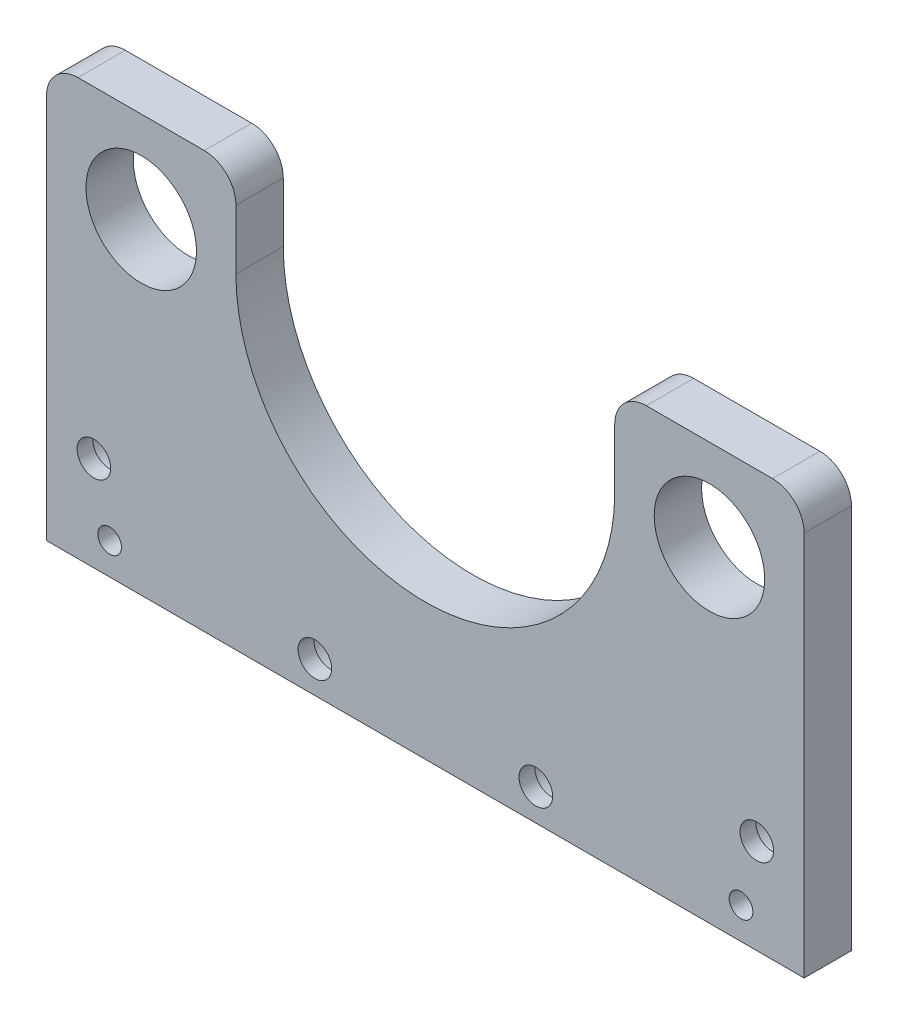
ISO-10303-21;
HEADER;
FILE_DESCRIPTION(('STEP AP214'),'2;1');
FILE_NAME('part.step','',(''),(''),'','','');
FILE_SCHEMA(('AUTOMOTIVE_DESIGN { 1 0 10303 214 1 1 1 1 }'));
ENDSEC;
DATA;
#1=APPLICATION_CONTEXT('core data for automotive mechanical design processes');
#2=APPLICATION_PROTOCOL_DEFINITION('international standard','automotive_design',2000,#1);
#3=PRODUCT_CONTEXT('',#1,'mechanical');
#4=PRODUCT('Part','Part','',(#3));
#5=PRODUCT_RELATED_PRODUCT_CATEGORY('part','',(#4));
#6=PRODUCT_DEFINITION_FORMATION('','',#4);
#7=PRODUCT_DEFINITION_CONTEXT('part definition',#1,'design');
#8=PRODUCT_DEFINITION('design','',#6,#7);
#9=PRODUCT_DEFINITION_SHAPE('','',#8);
#10=(LENGTH_UNIT() NAMED_UNIT(*) SI_UNIT(.MILLI.,.METRE.));
#11=(NAMED_UNIT(*) PLANE_ANGLE_UNIT() SI_UNIT($,.RADIAN.));
#12=(NAMED_UNIT(*) SI_UNIT($,.STERADIAN.) SOLID_ANGLE_UNIT());
#13=UNCERTAINTY_MEASURE_WITH_UNIT(LENGTH_MEASURE(1.E-05),#10,'distance_accuracy_value','');
#14=(GEOMETRIC_REPRESENTATION_CONTEXT(3) GLOBAL_UNCERTAINTY_ASSIGNED_CONTEXT((#13)) GLOBAL_UNIT_ASSIGNED_CONTEXT((#10,
#11,#12)) REPRESENTATION_CONTEXT('',''));
#15=CARTESIAN_POINT('',(0.,0.,0.));
#16=DIRECTION('',(0.,0.,1.));
#17=DIRECTION('',(1.,0.,0.));
#18=AXIS2_PLACEMENT_3D('',#15,#16,#17);
#19=CARTESIAN_POINT('',(-69.85,11.98626,4.7625));
#20=DIRECTION('',(0.,0.,-1.));
#21=DIRECTION('',(-1.,0.,0.));
#22=AXIS2_PLACEMENT_3D('',#19,#20,#21);
#23=PLANE('',#22);
#24=CARTESIAN_POINT('',(-66.675,-46.43374,4.7625));
#25=DIRECTION('',(0.,0.,-1.));
#26=DIRECTION('',(-1.,0.,0.));
#27=AXIS2_PLACEMENT_3D('',#24,#25,#26);
#28=CIRCLE('',#27,3.3782);
#29=CARTESIAN_POINT('',(-70.0532,-46.43374,4.7625));
#30=VERTEX_POINT('',#29);
#31=EDGE_CURVE('E394',#30,#30,#28,.T.);
#32=ORIENTED_EDGE('',*,*,#31,.T.);
#33=EDGE_LOOP('',(#32));
#34=FACE_BOUND('',#33,.T.);
#35=CARTESIAN_POINT('',(-22.225,-59.13374,4.7625));
#36=DIRECTION('',(0.,0.,-1.));
#37=DIRECTION('',(-1.,0.,0.));
#38=AXIS2_PLACEMENT_3D('',#35,#36,#37);
#39=CIRCLE('',#38,3.3782);
#40=CARTESIAN_POINT('',(-25.6032,-59.13374,4.7625));
#41=VERTEX_POINT('',#40);
#42=EDGE_CURVE('E410',#41,#41,#39,.T.);
#43=ORIENTED_EDGE('',*,*,#42,.T.);
#44=EDGE_LOOP('',(#43));
#45=FACE_BOUND('',#44,.T.);
#46=CARTESIAN_POINT('',(66.675,-46.43374,4.7625));
#47=DIRECTION('',(0.,0.,-1.));
#48=DIRECTION('',(-1.,0.,0.));
#49=AXIS2_PLACEMENT_3D('',#46,#47,#48);
#50=CIRCLE('',#49,3.3782);
#51=CARTESIAN_POINT('',(63.2968,-46.43374,4.7625));
#52=VERTEX_POINT('',#51);
#53=EDGE_CURVE('E426',#52,#52,#50,.T.);
#54=ORIENTED_EDGE('',*,*,#53,.T.);
#55=EDGE_LOOP('',(#54));
#56=FACE_BOUND('',#55,.T.);
#57=CARTESIAN_POINT('',(22.225,-59.13374,4.7625));
#58=DIRECTION('',(0.,0.,-1.));
#59=DIRECTION('',(-1.,0.,0.));
#60=AXIS2_PLACEMENT_3D('',#57,#58,#59);
#61=CIRCLE('',#60,3.3782);
#62=CARTESIAN_POINT('',(18.8468,-59.13374,4.7625));
#63=VERTEX_POINT('',#62);
#64=EDGE_CURVE('E442',#63,#63,#61,.T.);
#65=ORIENTED_EDGE('',*,*,#64,.T.);
#66=EDGE_LOOP('',(#65));
#67=FACE_BOUND('',#66,.T.);
#68=CARTESIAN_POINT('',(-69.85,11.98626,4.7625));
#69=DIRECTION('',(0.,0.,1.));
#70=DIRECTION('',(-1.,0.,0.));
#71=AXIS2_PLACEMENT_3D('',#68,#69,#70);
#72=CIRCLE('',#71,6.34999999999999);
#73=CARTESIAN_POINT('',(-69.85,18.33626,4.7625));
#74=VERTEX_POINT('',#73);
#75=CARTESIAN_POINT('',(-76.2,11.98626,4.7625));
#76=VERTEX_POINT('',#75);
#77=EDGE_CURVE('E202',#74,#76,#72,.T.);
#78=ORIENTED_EDGE('',*,*,#77,.T.);
#79=DIRECTION('',(0.,-1.,0.));
#80=VECTOR('',#79,1.);
#81=CARTESIAN_POINT('',(-76.2,11.98626,4.7625));
#82=LINE('',#81,#80);
#83=CARTESIAN_POINT('',(-76.2,-65.48374,4.7625));
#84=VERTEX_POINT('',#83);
#85=EDGE_CURVE('E114',#76,#84,#82,.T.);
#86=ORIENTED_EDGE('',*,*,#85,.T.);
#87=DIRECTION('',(1.,0.,0.));
#88=VECTOR('',#87,1.);
#89=CARTESIAN_POINT('',(76.2,-65.48374,4.7625));
#90=LINE('',#89,#88);
#91=CARTESIAN_POINT('',(76.2,-65.48374,4.7625));
#92=VERTEX_POINT('',#91);
#93=EDGE_CURVE('E239',#84,#92,#90,.T.);
#94=ORIENTED_EDGE('',*,*,#93,.T.);
#95=DIRECTION('',(0.,1.,0.));
#96=VECTOR('',#95,1.);
#97=CARTESIAN_POINT('',(76.2,11.98626,4.7625));
#98=LINE('',#97,#96);
#99=CARTESIAN_POINT('',(76.2,11.98626,4.7625));
#100=VERTEX_POINT('',#99);
#101=EDGE_CURVE('E259',#92,#100,#98,.T.);
#102=ORIENTED_EDGE('',*,*,#101,.T.);
#103=CARTESIAN_POINT('',(69.85,11.98626,4.7625));
#104=DIRECTION('',(0.,0.,1.));
#105=DIRECTION('',(1.,0.,0.));
#106=AXIS2_PLACEMENT_3D('',#103,#104,#105);
#107=CIRCLE('',#106,6.34999999999999);
#108=CARTESIAN_POINT('',(69.85,18.33626,4.7625));
#109=VERTEX_POINT('',#108);
#110=EDGE_CURVE('E255',#100,#109,#107,.T.);
#111=ORIENTED_EDGE('',*,*,#110,.T.);
#112=DIRECTION('',(-1.,0.,0.));
#113=VECTOR('',#112,1.);
#114=CARTESIAN_POINT('',(69.85,18.33626,4.7625));
#115=LINE('',#114,#113);
#116=CARTESIAN_POINT('',(44.45,18.33626,4.7625));
#117=VERTEX_POINT('',#116);
#118=EDGE_CURVE('E258',#109,#117,#115,.T.);
#119=ORIENTED_EDGE('',*,*,#118,.T.);
#120=CARTESIAN_POINT('',(44.45,11.98626,4.7625));
#121=DIRECTION('',(0.,0.,1.));
#122=DIRECTION('',(1.,0.,0.));
#123=AXIS2_PLACEMENT_3D('',#120,#121,#122);
#124=CIRCLE('',#123,6.34999999999999);
#125=CARTESIAN_POINT('',(38.1,11.98626,4.7625));
#126=VERTEX_POINT('',#125);
#127=EDGE_CURVE('E263',#117,#126,#124,.T.);
#128=ORIENTED_EDGE('',*,*,#127,.T.);
#129=DIRECTION('',(0.,-1.,0.));
#130=VECTOR('',#129,1.);
#131=CARTESIAN_POINT('',(38.1,0.,4.7625));
#132=LINE('',#131,#130);
#133=CARTESIAN_POINT('',(38.1,0.,4.7625));
#134=VERTEX_POINT('',#133);
#135=EDGE_CURVE('E270',#126,#134,#132,.T.);
#136=ORIENTED_EDGE('',*,*,#135,.T.);
#137=CARTESIAN_POINT('',(0.,0.,4.7625));
#138=DIRECTION('',(0.,0.,-1.));
#139=DIRECTION('',(1.,0.,0.));
#140=AXIS2_PLACEMENT_3D('',#137,#138,#139);
#141=CIRCLE('',#140,38.1);
#142=CARTESIAN_POINT('',(-38.1,0.,4.7625));
#143=VERTEX_POINT('',#142);
#144=EDGE_CURVE('E145',#134,#143,#141,.T.);
#145=ORIENTED_EDGE('',*,*,#144,.T.);
#146=DIRECTION('',(0.,1.,0.));
#147=VECTOR('',#146,1.);
#148=CARTESIAN_POINT('',(-38.1,0.,4.7625));
#149=LINE('',#148,#147);
#150=CARTESIAN_POINT('',(-38.1,11.98626,4.7625));
#151=VERTEX_POINT('',#150);
#152=EDGE_CURVE('E139',#143,#151,#149,.T.);
#153=ORIENTED_EDGE('',*,*,#152,.T.);
#154=CARTESIAN_POINT('',(-44.45,11.98626,4.7625));
#155=DIRECTION('',(0.,0.,1.));
#156=DIRECTION('',(-1.,0.,0.));
#157=AXIS2_PLACEMENT_3D('',#154,#155,#156);
#158=CIRCLE('',#157,6.34999999999999);
#159=CARTESIAN_POINT('',(-44.45,18.33626,4.7625));
#160=VERTEX_POINT('',#159);
#161=EDGE_CURVE('E143',#151,#160,#158,.T.);
#162=ORIENTED_EDGE('',*,*,#161,.T.);
#163=DIRECTION('',(-1.,0.,0.));
#164=VECTOR('',#163,1.);
#165=CARTESIAN_POINT('',(-69.85,18.33626,4.7625));
#166=LINE('',#165,#164);
#167=EDGE_CURVE('E59',#160,#74,#166,.T.);
#168=ORIENTED_EDGE('',*,*,#167,.T.);
#169=EDGE_LOOP('',(#78,#86,#94,#102,#111,#119,#128,#136,#145,#153,#162,#168));
#170=FACE_BOUND('',#169,.T.);
#171=CARTESIAN_POINT('',(-57.15,0.,4.7625));
#172=DIRECTION('',(0.,0.,1.));
#173=DIRECTION('',(1.,0.,0.));
#174=AXIS2_PLACEMENT_3D('',#171,#172,#173);
#175=CIRCLE('',#174,11.1125);
#176=CARTESIAN_POINT('',(-68.2625,0.,4.7625));
#177=VERTEX_POINT('',#176);
#178=EDGE_CURVE('E172',#177,#177,#175,.T.);
#179=ORIENTED_EDGE('',*,*,#178,.F.);
#180=EDGE_LOOP('',(#179));
#181=FACE_BOUND('',#180,.T.);
#182=CARTESIAN_POINT('',(57.15,0.,4.7625));
#183=DIRECTION('',(0.,0.,1.));
#184=DIRECTION('',(1.,0.,0.));
#185=AXIS2_PLACEMENT_3D('',#182,#183,#184);
#186=CIRCLE('',#185,11.1125);
#187=CARTESIAN_POINT('',(46.0375,0.,4.7625));
#188=VERTEX_POINT('',#187);
#189=EDGE_CURVE('E459',#188,#188,#186,.T.);
#190=ORIENTED_EDGE('',*,*,#189,.F.);
#191=EDGE_LOOP('',(#190));
#192=FACE_BOUND('',#191,.T.);
#193=CARTESIAN_POINT('',(-63.5,-59.13374,4.7625));
#194=DIRECTION('',(0.,0.,-1.));
#195=DIRECTION('',(-1.,0.,0.));
#196=AXIS2_PLACEMENT_3D('',#193,#194,#195);
#197=CIRCLE('',#196,2.38125);
#198=CARTESIAN_POINT('',(-65.88125,-59.13374,4.7625));
#199=VERTEX_POINT('',#198);
#200=EDGE_CURVE('E381',#199,#199,#197,.T.);
#201=ORIENTED_EDGE('',*,*,#200,.T.);
#202=EDGE_LOOP('',(#201));
#203=FACE_BOUND('',#202,.T.);
#204=CARTESIAN_POINT('',(63.5,-59.13374,4.7625));
#205=DIRECTION('',(0.,0.,-1.));
#206=DIRECTION('',(-1.,0.,0.));
#207=AXIS2_PLACEMENT_3D('',#204,#205,#206);
#208=CIRCLE('',#207,2.38125);
#209=CARTESIAN_POINT('',(61.11875,-59.13374,4.7625));
#210=VERTEX_POINT('',#209);
#211=EDGE_CURVE('E382',#210,#210,#208,.T.);
#212=ORIENTED_EDGE('',*,*,#211,.T.);
#213=EDGE_LOOP('',(#212));
#214=FACE_BOUND('',#213,.T.);
#215=ADVANCED_FACE('F41',(#34,#45,#56,#67,#170,#181,#192,#203,#214),#23,.F.);
#216=CARTESIAN_POINT('',(-69.85,11.98626,-4.7625));
#217=DIRECTION('',(0.,0.,-1.));
#218=DIRECTION('',(-1.,0.,0.));
#219=AXIS2_PLACEMENT_3D('',#216,#217,#218);
#220=PLANE('',#219);
#221=CARTESIAN_POINT('',(-66.675,-46.43374,-4.7625));
#222=DIRECTION('',(0.,0.,-1.));
#223=DIRECTION('',(-1.,0.,0.));
#224=AXIS2_PLACEMENT_3D('',#221,#222,#223);
#225=CIRCLE('',#224,5.55625);
#226=CARTESIAN_POINT('',(-72.23125,-46.43374,-4.7625));
#227=VERTEX_POINT('',#226);
#228=EDGE_CURVE('E406',#227,#227,#225,.T.);
#229=ORIENTED_EDGE('',*,*,#228,.F.);
#230=EDGE_LOOP('',(#229));
#231=FACE_BOUND('',#230,.T.);
#232=CARTESIAN_POINT('',(-22.225,-59.13374,-4.7625));
#233=DIRECTION('',(0.,0.,-1.));
#234=DIRECTION('',(-1.,0.,0.));
#235=AXIS2_PLACEMENT_3D('',#232,#233,#234);
#236=CIRCLE('',#235,5.55625);
#237=CARTESIAN_POINT('',(-27.78125,-59.13374,-4.7625));
#238=VERTEX_POINT('',#237);
#239=EDGE_CURVE('E422',#238,#238,#236,.T.);
#240=ORIENTED_EDGE('',*,*,#239,.F.);
#241=EDGE_LOOP('',(#240));
#242=FACE_BOUND('',#241,.T.);
#243=CARTESIAN_POINT('',(66.675,-46.43374,-4.7625));
#244=DIRECTION('',(0.,0.,-1.));
#245=DIRECTION('',(-1.,0.,0.));
#246=AXIS2_PLACEMENT_3D('',#243,#244,#245);
#247=CIRCLE('',#246,5.55625);
#248=CARTESIAN_POINT('',(61.11875,-46.43374,-4.7625));
#249=VERTEX_POINT('',#248);
#250=EDGE_CURVE('E438',#249,#249,#247,.T.);
#251=ORIENTED_EDGE('',*,*,#250,.F.);
#252=EDGE_LOOP('',(#251));
#253=FACE_BOUND('',#252,.T.);
#254=CARTESIAN_POINT('',(22.225,-59.13374,-4.7625));
#255=DIRECTION('',(0.,0.,-1.));
#256=DIRECTION('',(-1.,0.,0.));
#257=AXIS2_PLACEMENT_3D('',#254,#255,#256);
#258=CIRCLE('',#257,5.55625);
#259=CARTESIAN_POINT('',(16.66875,-59.13374,-4.7625));
#260=VERTEX_POINT('',#259);
#261=EDGE_CURVE('E454',#260,#260,#258,.T.);
#262=ORIENTED_EDGE('',*,*,#261,.F.);
#263=EDGE_LOOP('',(#262));
#264=FACE_BOUND('',#263,.T.);
#265=CARTESIAN_POINT('',(-57.15,0.,-4.7625));
#266=DIRECTION('',(0.,0.,1.));
#267=DIRECTION('',(1.,0.,0.));
#268=AXIS2_PLACEMENT_3D('',#265,#266,#267);
#269=CIRCLE('',#268,11.1125);
#270=CARTESIAN_POINT('',(-68.2625,0.,-4.7625));
#271=VERTEX_POINT('',#270);
#272=EDGE_CURVE('E463',#271,#271,#269,.T.);
#273=ORIENTED_EDGE('',*,*,#272,.T.);
#274=EDGE_LOOP('',(#273));
#275=FACE_BOUND('',#274,.T.);
#276=CARTESIAN_POINT('',(-69.85,11.98626,-4.7625));
#277=DIRECTION('',(0.,0.,1.));
#278=DIRECTION('',(-1.,0.,0.));
#279=AXIS2_PLACEMENT_3D('',#276,#277,#278);
#280=CIRCLE('',#279,6.34999999999999);
#281=CARTESIAN_POINT('',(-69.85,18.33626,-4.7625));
#282=VERTEX_POINT('',#281);
#283=CARTESIAN_POINT('',(-76.2,11.98626,-4.7625));
#284=VERTEX_POINT('',#283);
#285=EDGE_CURVE('E167',#282,#284,#280,.T.);
#286=ORIENTED_EDGE('',*,*,#285,.F.);
#287=DIRECTION('',(-1.,0.,0.));
#288=VECTOR('',#287,1.);
#289=CARTESIAN_POINT('',(-69.85,18.33626,-4.7625));
#290=LINE('',#289,#288);
#291=CARTESIAN_POINT('',(-44.45,18.33626,-4.7625));
#292=VERTEX_POINT('',#291);
#293=EDGE_CURVE('E106',#292,#282,#290,.T.);
#294=ORIENTED_EDGE('',*,*,#293,.F.);
#295=CARTESIAN_POINT('',(-44.45,11.98626,-4.7625));
#296=DIRECTION('',(0.,0.,1.));
#297=DIRECTION('',(-1.,0.,0.));
#298=AXIS2_PLACEMENT_3D('',#295,#296,#297);
#299=CIRCLE('',#298,6.34999999999999);
#300=CARTESIAN_POINT('',(-38.1,11.98626,-4.7625));
#301=VERTEX_POINT('',#300);
#302=EDGE_CURVE('E100',#301,#292,#299,.T.);
#303=ORIENTED_EDGE('',*,*,#302,.F.);
#304=DIRECTION('',(0.,1.,0.));
#305=VECTOR('',#304,1.);
#306=CARTESIAN_POINT('',(-38.1,0.,-4.7625));
#307=LINE('',#306,#305);
#308=CARTESIAN_POINT('',(-38.1,0.,-4.7625));
#309=VERTEX_POINT('',#308);
#310=EDGE_CURVE('E154',#309,#301,#307,.T.);
#311=ORIENTED_EDGE('',*,*,#310,.F.);
#312=CARTESIAN_POINT('',(0.,0.,-4.7625));
#313=DIRECTION('',(0.,0.,-1.));
#314=DIRECTION('',(1.,0.,0.));
#315=AXIS2_PLACEMENT_3D('',#312,#313,#314);
#316=CIRCLE('',#315,38.1);
#317=CARTESIAN_POINT('',(38.1,0.,-4.7625));
#318=VERTEX_POINT('',#317);
#319=EDGE_CURVE('E193',#318,#309,#316,.T.);
#320=ORIENTED_EDGE('',*,*,#319,.F.);
#321=DIRECTION('',(0.,-1.,0.));
#322=VECTOR('',#321,1.);
#323=CARTESIAN_POINT('',(38.1,0.,-4.7625));
#324=LINE('',#323,#322);
#325=CARTESIAN_POINT('',(38.1,11.98626,-4.7625));
#326=VERTEX_POINT('',#325);
#327=EDGE_CURVE('E190',#326,#318,#324,.T.);
#328=ORIENTED_EDGE('',*,*,#327,.F.);
#329=CARTESIAN_POINT('',(44.45,11.98626,-4.7625));
#330=DIRECTION('',(0.,0.,1.));
#331=DIRECTION('',(1.,0.,0.));
#332=AXIS2_PLACEMENT_3D('',#329,#330,#331);
#333=CIRCLE('',#332,6.34999999999999);
#334=CARTESIAN_POINT('',(44.45,18.33626,-4.7625));
#335=VERTEX_POINT('',#334);
#336=EDGE_CURVE('E187',#335,#326,#333,.T.);
#337=ORIENTED_EDGE('',*,*,#336,.F.);
#338=DIRECTION('',(-1.,0.,0.));
#339=VECTOR('',#338,1.);
#340=CARTESIAN_POINT('',(69.85,18.33626,-4.7625));
#341=LINE('',#340,#339);
#342=CARTESIAN_POINT('',(69.85,18.33626,-4.7625));
#343=VERTEX_POINT('',#342);
#344=EDGE_CURVE('E184',#343,#335,#341,.T.);
#345=ORIENTED_EDGE('',*,*,#344,.F.);
#346=CARTESIAN_POINT('',(69.85,11.98626,-4.7625));
#347=DIRECTION('',(0.,0.,1.));
#348=DIRECTION('',(1.,0.,0.));
#349=AXIS2_PLACEMENT_3D('',#346,#347,#348);
#350=CIRCLE('',#349,6.34999999999999);
#351=CARTESIAN_POINT('',(76.2,11.98626,-4.7625));
#352=VERTEX_POINT('',#351);
#353=EDGE_CURVE('E181',#352,#343,#350,.T.);
#354=ORIENTED_EDGE('',*,*,#353,.F.);
#355=DIRECTION('',(0.,1.,0.));
#356=VECTOR('',#355,1.);
#357=CARTESIAN_POINT('',(76.2,11.98626,-4.7625));
#358=LINE('',#357,#356);
#359=CARTESIAN_POINT('',(76.2,-65.48374,-4.7625));
#360=VERTEX_POINT('',#359);
#361=EDGE_CURVE('E178',#360,#352,#358,.T.);
#362=ORIENTED_EDGE('',*,*,#361,.F.);
#363=DIRECTION('',(1.,0.,0.));
#364=VECTOR('',#363,1.);
#365=CARTESIAN_POINT('',(76.2,-65.48374,-4.7625));
#366=LINE('',#365,#364);
#367=CARTESIAN_POINT('',(-76.2,-65.48374,-4.7625));
#368=VERTEX_POINT('',#367);
#369=EDGE_CURVE('E175',#368,#360,#366,.T.);
#370=ORIENTED_EDGE('',*,*,#369,.F.);
#371=DIRECTION('',(0.,-1.,0.));
#372=VECTOR('',#371,1.);
#373=CARTESIAN_POINT('',(-76.2,11.98626,-4.7625));
#374=LINE('',#373,#372);
#375=EDGE_CURVE('E171',#284,#368,#374,.T.);
#376=ORIENTED_EDGE('',*,*,#375,.F.);
#377=EDGE_LOOP('',(#286,#294,#303,#311,#320,#328,#337,#345,#354,#362,#370,#376));
#378=FACE_BOUND('',#377,.T.);
#379=CARTESIAN_POINT('',(57.15,0.,-4.7625));
#380=DIRECTION('',(0.,0.,1.));
#381=DIRECTION('',(1.,0.,0.));
#382=AXIS2_PLACEMENT_3D('',#379,#380,#381);
#383=CIRCLE('',#382,11.1125);
#384=CARTESIAN_POINT('',(46.0375,0.,-4.7625));
#385=VERTEX_POINT('',#384);
#386=EDGE_CURVE('E458',#385,#385,#383,.T.);
#387=ORIENTED_EDGE('',*,*,#386,.T.);
#388=EDGE_LOOP('',(#387));
#389=FACE_BOUND('',#388,.T.);
#390=ADVANCED_FACE('F243',(#231,#242,#253,#264,#275,#378,#389),#220,.T.);
#391=CARTESIAN_POINT('',(-69.85,11.98626,4.7625));
#392=DIRECTION('',(0.,0.,-1.));
#393=DIRECTION('',(-1.,0.,0.));
#394=AXIS2_PLACEMENT_3D('',#391,#392,#393);
#395=CYLINDRICAL_SURFACE('',#394,6.34999999999999);
#396=ORIENTED_EDGE('',*,*,#285,.T.);
#397=DIRECTION('',(0.,0.,-1.));
#398=VECTOR('',#397,1.);
#399=CARTESIAN_POINT('',(-76.2,11.98626,4.7625));
#400=LINE('',#399,#398);
#401=EDGE_CURVE('E11',#76,#284,#400,.T.);
#402=ORIENTED_EDGE('',*,*,#401,.F.);
#403=ORIENTED_EDGE('',*,*,#77,.F.);
#404=DIRECTION('',(0.,0.,-1.));
#405=VECTOR('',#404,1.);
#406=CARTESIAN_POINT('',(-69.85,18.33626,4.7625));
#407=LINE('',#406,#405);
#408=EDGE_CURVE('E163',#74,#282,#407,.T.);
#409=ORIENTED_EDGE('',*,*,#408,.T.);
#410=EDGE_LOOP('',(#396,#402,#403,#409));
#411=FACE_BOUND('',#410,.T.);
#412=ADVANCED_FACE('F43',(#411),#395,.T.);
#413=CARTESIAN_POINT('',(-76.2,11.98626,4.7625));
#414=DIRECTION('',(1.,0.,0.));
#415=DIRECTION('',(0.,1.,0.));
#416=AXIS2_PLACEMENT_3D('',#413,#414,#415);
#417=PLANE('',#416);
#418=ORIENTED_EDGE('',*,*,#375,.T.);
#419=DIRECTION('',(0.,0.,-1.));
#420=VECTOR('',#419,1.);
#421=CARTESIAN_POINT('',(-76.2,-65.48374,4.7625));
#422=LINE('',#421,#420);
#423=EDGE_CURVE('E51',#84,#368,#422,.T.);
#424=ORIENTED_EDGE('',*,*,#423,.F.);
#425=ORIENTED_EDGE('',*,*,#85,.F.);
#426=ORIENTED_EDGE('',*,*,#401,.T.);
#427=EDGE_LOOP('',(#418,#424,#425,#426));
#428=FACE_BOUND('',#427,.T.);
#429=ADVANCED_FACE('F673',(#428),#417,.F.);
#430=CARTESIAN_POINT('',(76.2,-65.48374,4.7625));
#431=DIRECTION('',(0.,1.,0.));
#432=DIRECTION('',(0.,0.,1.));
#433=AXIS2_PLACEMENT_3D('',#430,#431,#432);
#434=PLANE('',#433);
#435=ORIENTED_EDGE('',*,*,#369,.T.);
#436=DIRECTION('',(0.,0.,-1.));
#437=VECTOR('',#436,1.);
#438=CARTESIAN_POINT('',(76.2,-65.48374,4.7625));
#439=LINE('',#438,#437);
#440=EDGE_CURVE('E229',#92,#360,#439,.T.);
#441=ORIENTED_EDGE('',*,*,#440,.F.);
#442=ORIENTED_EDGE('',*,*,#93,.F.);
#443=ORIENTED_EDGE('',*,*,#423,.T.);
#444=EDGE_LOOP('',(#435,#441,#442,#443));
#445=FACE_BOUND('',#444,.T.);
#446=ADVANCED_FACE('F237',(#445),#434,.F.);
#447=CARTESIAN_POINT('',(76.2,11.98626,4.7625));
#448=DIRECTION('',(-1.,0.,0.));
#449=DIRECTION('',(0.,-1.,0.));
#450=AXIS2_PLACEMENT_3D('',#447,#448,#449);
#451=PLANE('',#450);
#452=ORIENTED_EDGE('',*,*,#361,.T.);
#453=DIRECTION('',(0.,0.,-1.));
#454=VECTOR('',#453,1.);
#455=CARTESIAN_POINT('',(76.2,11.98626,4.7625));
#456=LINE('',#455,#454);
#457=EDGE_CURVE('E225',#100,#352,#456,.T.);
#458=ORIENTED_EDGE('',*,*,#457,.F.);
#459=ORIENTED_EDGE('',*,*,#101,.F.);
#460=ORIENTED_EDGE('',*,*,#440,.T.);
#461=EDGE_LOOP('',(#452,#458,#459,#460));
#462=FACE_BOUND('',#461,.T.);
#463=ADVANCED_FACE('F249',(#462),#451,.F.);
#464=CARTESIAN_POINT('',(69.85,11.98626,4.7625));
#465=DIRECTION('',(0.,0.,-1.));
#466=DIRECTION('',(-1.,0.,0.));
#467=AXIS2_PLACEMENT_3D('',#464,#465,#466);
#468=CYLINDRICAL_SURFACE('',#467,6.34999999999999);
#469=ORIENTED_EDGE('',*,*,#353,.T.);
#470=DIRECTION('',(0.,0.,-1.));
#471=VECTOR('',#470,1.);
#472=CARTESIAN_POINT('',(69.85,18.33626,4.7625));
#473=LINE('',#472,#471);
#474=EDGE_CURVE('E221',#109,#343,#473,.T.);
#475=ORIENTED_EDGE('',*,*,#474,.F.);
#476=ORIENTED_EDGE('',*,*,#110,.F.);
#477=ORIENTED_EDGE('',*,*,#457,.T.);
#478=EDGE_LOOP('',(#469,#475,#476,#477));
#479=FACE_BOUND('',#478,.T.);
#480=ADVANCED_FACE('F253',(#479),#468,.T.);
#481=CARTESIAN_POINT('',(69.85,18.33626,4.7625));
#482=DIRECTION('',(0.,-1.,0.));
#483=DIRECTION('',(1.,0.,0.));
#484=AXIS2_PLACEMENT_3D('',#481,#482,#483);
#485=PLANE('',#484);
#486=ORIENTED_EDGE('',*,*,#344,.T.);
#487=DIRECTION('',(0.,0.,-1.));
#488=VECTOR('',#487,1.);
#489=CARTESIAN_POINT('',(44.45,18.33626,4.7625));
#490=LINE('',#489,#488);
#491=EDGE_CURVE('E217',#117,#335,#490,.T.);
#492=ORIENTED_EDGE('',*,*,#491,.F.);
#493=ORIENTED_EDGE('',*,*,#118,.F.);
#494=ORIENTED_EDGE('',*,*,#474,.T.);
#495=EDGE_LOOP('',(#486,#492,#493,#494));
#496=FACE_BOUND('',#495,.T.);
#497=ADVANCED_FACE('F638',(#496),#485,.F.);
#498=CARTESIAN_POINT('',(44.45,11.98626,4.7625));
#499=DIRECTION('',(0.,0.,-1.));
#500=DIRECTION('',(-1.,0.,0.));
#501=AXIS2_PLACEMENT_3D('',#498,#499,#500);
#502=CYLINDRICAL_SURFACE('',#501,6.34999999999999);
#503=ORIENTED_EDGE('',*,*,#336,.T.);
#504=DIRECTION('',(0.,0.,-1.));
#505=VECTOR('',#504,1.);
#506=CARTESIAN_POINT('',(38.1,11.98626,4.7625));
#507=LINE('',#506,#505);
#508=EDGE_CURVE('E213',#126,#326,#507,.T.);
#509=ORIENTED_EDGE('',*,*,#508,.F.);
#510=ORIENTED_EDGE('',*,*,#127,.F.);
#511=ORIENTED_EDGE('',*,*,#491,.T.);
#512=EDGE_LOOP('',(#503,#509,#510,#511));
#513=FACE_BOUND('',#512,.T.);
#514=ADVANCED_FACE('F629',(#513),#502,.T.);
#515=CARTESIAN_POINT('',(38.1,0.,4.7625));
#516=DIRECTION('',(1.,0.,0.));
#517=DIRECTION('',(0.,0.,-1.));
#518=AXIS2_PLACEMENT_3D('',#515,#516,#517);
#519=PLANE('',#518);
#520=ORIENTED_EDGE('',*,*,#327,.T.);
#521=DIRECTION('',(0.,0.,-1.));
#522=VECTOR('',#521,1.);
#523=CARTESIAN_POINT('',(38.1,0.,4.7625));
#524=LINE('',#523,#522);
#525=EDGE_CURVE('E209',#134,#318,#524,.T.);
#526=ORIENTED_EDGE('',*,*,#525,.F.);
#527=ORIENTED_EDGE('',*,*,#135,.F.);
#528=ORIENTED_EDGE('',*,*,#508,.T.);
#529=EDGE_LOOP('',(#520,#526,#527,#528));
#530=FACE_BOUND('',#529,.T.);
#531=ADVANCED_FACE('F278',(#530),#519,.F.);
#532=CARTESIAN_POINT('',(0.,0.,4.7625));
#533=DIRECTION('',(0.,0.,-1.));
#534=DIRECTION('',(-1.,0.,0.));
#535=AXIS2_PLACEMENT_3D('',#532,#533,#534);
#536=CYLINDRICAL_SURFACE('',#535,38.1);
#537=ORIENTED_EDGE('',*,*,#319,.T.);
#538=DIRECTION('',(0.,0.,-1.));
#539=VECTOR('',#538,1.);
#540=CARTESIAN_POINT('',(-38.1,0.,4.7625));
#541=LINE('',#540,#539);
#542=EDGE_CURVE('E156',#143,#309,#541,.T.);
#543=ORIENTED_EDGE('',*,*,#542,.F.);
#544=ORIENTED_EDGE('',*,*,#144,.F.);
#545=ORIENTED_EDGE('',*,*,#525,.T.);
#546=EDGE_LOOP('',(#537,#543,#544,#545));
#547=FACE_BOUND('',#546,.T.);
#548=ADVANCED_FACE('F282',(#547),#536,.F.);
#549=CARTESIAN_POINT('',(-38.1,0.,4.7625));
#550=DIRECTION('',(-1.,0.,0.));
#551=DIRECTION('',(0.,0.,1.));
#552=AXIS2_PLACEMENT_3D('',#549,#550,#551);
#553=PLANE('',#552);
#554=ORIENTED_EDGE('',*,*,#310,.T.);
#555=DIRECTION('',(0.,0.,-1.));
#556=VECTOR('',#555,1.);
#557=CARTESIAN_POINT('',(-38.1,11.98626,4.7625));
#558=LINE('',#557,#556);
#559=EDGE_CURVE('E151',#151,#301,#558,.T.);
#560=ORIENTED_EDGE('',*,*,#559,.F.);
#561=ORIENTED_EDGE('',*,*,#152,.F.);
#562=ORIENTED_EDGE('',*,*,#542,.T.);
#563=EDGE_LOOP('',(#554,#560,#561,#562));
#564=FACE_BOUND('',#563,.T.);
#565=ADVANCED_FACE('F152',(#564),#553,.F.);
#566=CARTESIAN_POINT('',(-44.45,11.98626,4.7625));
#567=DIRECTION('',(0.,0.,-1.));
#568=DIRECTION('',(-1.,0.,0.));
#569=AXIS2_PLACEMENT_3D('',#566,#567,#568);
#570=CYLINDRICAL_SURFACE('',#569,6.34999999999999);
#571=ORIENTED_EDGE('',*,*,#302,.T.);
#572=DIRECTION('',(0.,0.,-1.));
#573=VECTOR('',#572,1.);
#574=CARTESIAN_POINT('',(-44.45,18.33626,4.7625));
#575=LINE('',#574,#573);
#576=EDGE_CURVE('E157',#160,#292,#575,.T.);
#577=ORIENTED_EDGE('',*,*,#576,.F.);
#578=ORIENTED_EDGE('',*,*,#161,.F.);
#579=ORIENTED_EDGE('',*,*,#559,.T.);
#580=EDGE_LOOP('',(#571,#577,#578,#579));
#581=FACE_BOUND('',#580,.T.);
#582=ADVANCED_FACE('F159',(#581),#570,.T.);
#583=CARTESIAN_POINT('',(-69.85,18.33626,4.7625));
#584=DIRECTION('',(0.,-1.,0.));
#585=DIRECTION('',(1.,0.,0.));
#586=AXIS2_PLACEMENT_3D('',#583,#584,#585);
#587=PLANE('',#586);
#588=ORIENTED_EDGE('',*,*,#293,.T.);
#589=ORIENTED_EDGE('',*,*,#408,.F.);
#590=ORIENTED_EDGE('',*,*,#167,.F.);
#591=ORIENTED_EDGE('',*,*,#576,.T.);
#592=EDGE_LOOP('',(#588,#589,#590,#591));
#593=FACE_BOUND('',#592,.T.);
#594=ADVANCED_FACE('F286',(#593),#587,.F.);
#595=CARTESIAN_POINT('',(-57.15,0.,4.7625));
#596=DIRECTION('',(0.,0.,-1.));
#597=DIRECTION('',(-1.,0.,0.));
#598=AXIS2_PLACEMENT_3D('',#595,#596,#597);
#599=CYLINDRICAL_SURFACE('',#598,11.1125);
#600=CARTESIAN_POINT('',(-68.2625,0.,4.7625));
#601=CARTESIAN_POINT('',(-68.2625,0.,4.66328125));
#602=CARTESIAN_POINT('',(-68.2625,0.,4.5640625));
#603=CARTESIAN_POINT('',(-68.2625,0.,4.365625));
#604=CARTESIAN_POINT('',(-68.2625,0.,4.26640625));
#605=CARTESIAN_POINT('',(-68.2625,0.,4.06796875));
#606=CARTESIAN_POINT('',(-68.2625,0.,3.96875));
#607=CARTESIAN_POINT('',(-68.2625,0.,3.7703125));
#608=CARTESIAN_POINT('',(-68.2625,0.,3.67109375));
#609=CARTESIAN_POINT('',(-68.2625,0.,3.47265625));
#610=CARTESIAN_POINT('',(-68.2625,0.,3.3734375));
#611=CARTESIAN_POINT('',(-68.2625,0.,3.175));
#612=CARTESIAN_POINT('',(-68.2625,0.,3.07578125));
#613=CARTESIAN_POINT('',(-68.2625,0.,2.87734375));
#614=CARTESIAN_POINT('',(-68.2625,0.,2.778125));
#615=CARTESIAN_POINT('',(-68.2625,0.,2.5796875));
#616=CARTESIAN_POINT('',(-68.2625,0.,2.48046875));
#617=CARTESIAN_POINT('',(-68.2625,0.,2.28203125));
#618=CARTESIAN_POINT('',(-68.2625,0.,2.1828125));
#619=CARTESIAN_POINT('',(-68.2625,0.,1.984375));
#620=CARTESIAN_POINT('',(-68.2625,0.,1.88515625));
#621=CARTESIAN_POINT('',(-68.2625,0.,1.68671875));
#622=CARTESIAN_POINT('',(-68.2625,0.,1.5875));
#623=CARTESIAN_POINT('',(-68.2625,0.,1.3890625));
#624=CARTESIAN_POINT('',(-68.2625,0.,1.28984375));
#625=CARTESIAN_POINT('',(-68.2625,0.,1.09140625));
#626=CARTESIAN_POINT('',(-68.2625,0.,0.992187499999999));
#627=CARTESIAN_POINT('',(-68.2625,0.,0.793749999999999));
#628=CARTESIAN_POINT('',(-68.2625,0.,0.694531249999999));
#629=CARTESIAN_POINT('',(-68.2625,0.,0.496093749999999));
#630=CARTESIAN_POINT('',(-68.2625,0.,0.396874999999999));
#631=CARTESIAN_POINT('',(-68.2625,0.,0.198437499999999));
#632=CARTESIAN_POINT('',(-68.2625,0.,0.0992187499999992));
#633=CARTESIAN_POINT('',(-68.2625,0.,-0.0992187500000009));
#634=CARTESIAN_POINT('',(-68.2625,0.,-0.198437500000001));
#635=CARTESIAN_POINT('',(-68.2625,0.,-0.396875000000001));
#636=CARTESIAN_POINT('',(-68.2625,0.,-0.496093750000001));
#637=CARTESIAN_POINT('',(-68.2625,0.,-0.694531250000001));
#638=CARTESIAN_POINT('',(-68.2625,0.,-0.793750000000001));
#639=CARTESIAN_POINT('',(-68.2625,0.,-0.992187500000002));
#640=CARTESIAN_POINT('',(-68.2625,0.,-1.09140625));
#641=CARTESIAN_POINT('',(-68.2625,0.,-1.28984375));
#642=CARTESIAN_POINT('',(-68.2625,0.,-1.3890625));
#643=CARTESIAN_POINT('',(-68.2625,0.,-1.5875));
#644=CARTESIAN_POINT('',(-68.2625,0.,-1.68671875));
#645=CARTESIAN_POINT('',(-68.2625,0.,-1.88515625));
#646=CARTESIAN_POINT('',(-68.2625,0.,-1.984375));
#647=CARTESIAN_POINT('',(-68.2625,0.,-2.1828125));
#648=CARTESIAN_POINT('',(-68.2625,0.,-2.28203125));
#649=CARTESIAN_POINT('',(-68.2625,0.,-2.48046875));
#650=CARTESIAN_POINT('',(-68.2625,0.,-2.5796875));
#651=CARTESIAN_POINT('',(-68.2625,0.,-2.778125));
#652=CARTESIAN_POINT('',(-68.2625,0.,-2.87734375));
#653=CARTESIAN_POINT('',(-68.2625,0.,-3.07578125));
#654=CARTESIAN_POINT('',(-68.2625,0.,-3.175));
#655=CARTESIAN_POINT('',(-68.2625,0.,-3.3734375));
#656=CARTESIAN_POINT('',(-68.2625,0.,-3.47265625));
#657=CARTESIAN_POINT('',(-68.2625,0.,-3.67109375));
#658=CARTESIAN_POINT('',(-68.2625,0.,-3.7703125));
#659=CARTESIAN_POINT('',(-68.2625,0.,-3.96875));
#660=CARTESIAN_POINT('',(-68.2625,0.,-4.06796875));
#661=CARTESIAN_POINT('',(-68.2625,0.,-4.26640625));
#662=CARTESIAN_POINT('',(-68.2625,0.,-4.365625));
#663=CARTESIAN_POINT('',(-68.2625,0.,-4.5640625));
#664=CARTESIAN_POINT('',(-68.2625,0.,-4.66328125));
#665=CARTESIAN_POINT('',(-68.2625,0.,-4.7625));
#666=B_SPLINE_CURVE_WITH_KNOTS('',3,(#600,#601,#602,#603,#604,#605,#606,#607,#608,#609,#610,
#611,#612,#613,#614,#615,#616,#617,#618,#619,#620,#621,#622,#623,#624,#625,#626,#627,#628,#629,
#630,#631,#632,#633,#634,#635,#636,#637,#638,#639,#640,#641,#642,#643,#644,#645,#646,#647,#648,
#649,#650,#651,#652,#653,#654,#655,#656,#657,#658,#659,#660,#661,#662,#663,#664,#665),
.UNSPECIFIED.,.F.,.F.,(4,2,2,2,2,2,2,2,2,2,2,2,2,2,2,2,2,2,2,2,2,2,2,2,2,2,2,2,2,2,2,2,4),(0.,
0.297656249999999,0.595312499999999,0.89296875,1.190625,1.48828125,1.7859375,2.08359375,2.38125,
2.67890625,2.9765625,3.27421875,3.571875,3.86953125,4.1671875,4.46484375,4.7625,5.06015625,
5.3578125,5.65546875,5.953125,6.25078125,6.5484375,6.84609375,7.14375,7.44140625,7.7390625,
8.03671875,8.334375,8.63203125,8.9296875,9.22734375,9.525),.UNSPECIFIED.);
#667=EDGE_CURVE('BSEAM288',#177,#271,#666,.T.);
#668=ORIENTED_EDGE('',*,*,#178,.T.);
#669=ORIENTED_EDGE('',*,*,#272,.F.);
#670=ORIENTED_EDGE('',*,*,#667,.T.);
#671=ORIENTED_EDGE('',*,*,#667,.F.);
#672=EDGE_LOOP('',(#668,#670,#669,#671));
#673=FACE_BOUND('',#672,.T.);
#674=ADVANCED_FACE('F288',(#673),#599,.F.);
#675=CARTESIAN_POINT('',(57.15,0.,4.7625));
#676=DIRECTION('',(0.,0.,-1.));
#677=DIRECTION('',(-1.,0.,0.));
#678=AXIS2_PLACEMENT_3D('',#675,#676,#677);
#679=CYLINDRICAL_SURFACE('',#678,11.1125);
#680=CARTESIAN_POINT('',(46.0375,0.,4.7625));
#681=CARTESIAN_POINT('',(46.0375,0.,4.66328125));
#682=CARTESIAN_POINT('',(46.0375,0.,4.5640625));
#683=CARTESIAN_POINT('',(46.0375,0.,4.365625));
#684=CARTESIAN_POINT('',(46.0375,0.,4.26640625));
#685=CARTESIAN_POINT('',(46.0375,0.,4.06796875));
#686=CARTESIAN_POINT('',(46.0375,0.,3.96875));
#687=CARTESIAN_POINT('',(46.0375,0.,3.7703125));
#688=CARTESIAN_POINT('',(46.0375,0.,3.67109375));
#689=CARTESIAN_POINT('',(46.0375,0.,3.47265625));
#690=CARTESIAN_POINT('',(46.0375,0.,3.3734375));
#691=CARTESIAN_POINT('',(46.0375,0.,3.175));
#692=CARTESIAN_POINT('',(46.0375,0.,3.07578125));
#693=CARTESIAN_POINT('',(46.0375,0.,2.87734375));
#694=CARTESIAN_POINT('',(46.0375,0.,2.778125));
#695=CARTESIAN_POINT('',(46.0375,0.,2.5796875));
#696=CARTESIAN_POINT('',(46.0375,0.,2.48046875));
#697=CARTESIAN_POINT('',(46.0375,0.,2.28203125));
#698=CARTESIAN_POINT('',(46.0375,0.,2.1828125));
#699=CARTESIAN_POINT('',(46.0375,0.,1.984375));
#700=CARTESIAN_POINT('',(46.0375,0.,1.88515625));
#701=CARTESIAN_POINT('',(46.0375,0.,1.68671875));
#702=CARTESIAN_POINT('',(46.0375,0.,1.5875));
#703=CARTESIAN_POINT('',(46.0375,0.,1.3890625));
#704=CARTESIAN_POINT('',(46.0375,0.,1.28984375));
#705=CARTESIAN_POINT('',(46.0375,0.,1.09140625));
#706=CARTESIAN_POINT('',(46.0375,0.,0.992187499999999));
#707=CARTESIAN_POINT('',(46.0375,0.,0.793749999999999));
#708=CARTESIAN_POINT('',(46.0375,0.,0.694531249999999));
#709=CARTESIAN_POINT('',(46.0375,0.,0.496093749999999));
#710=CARTESIAN_POINT('',(46.0375,0.,0.396874999999999));
#711=CARTESIAN_POINT('',(46.0375,0.,0.198437499999999));
#712=CARTESIAN_POINT('',(46.0375,0.,0.0992187499999992));
#713=CARTESIAN_POINT('',(46.0375,0.,-0.0992187500000009));
#714=CARTESIAN_POINT('',(46.0375,0.,-0.198437500000001));
#715=CARTESIAN_POINT('',(46.0375,0.,-0.396875000000001));
#716=CARTESIAN_POINT('',(46.0375,0.,-0.496093750000001));
#717=CARTESIAN_POINT('',(46.0375,0.,-0.694531250000001));
#718=CARTESIAN_POINT('',(46.0375,0.,-0.793750000000001));
#719=CARTESIAN_POINT('',(46.0375,0.,-0.992187500000002));
#720=CARTESIAN_POINT('',(46.0375,0.,-1.09140625));
#721=CARTESIAN_POINT('',(46.0375,0.,-1.28984375));
#722=CARTESIAN_POINT('',(46.0375,0.,-1.3890625));
#723=CARTESIAN_POINT('',(46.0375,0.,-1.5875));
#724=CARTESIAN_POINT('',(46.0375,0.,-1.68671875));
#725=CARTESIAN_POINT('',(46.0375,0.,-1.88515625));
#726=CARTESIAN_POINT('',(46.0375,0.,-1.984375));
#727=CARTESIAN_POINT('',(46.0375,0.,-2.1828125));
#728=CARTESIAN_POINT('',(46.0375,0.,-2.28203125));
#729=CARTESIAN_POINT('',(46.0375,0.,-2.48046875));
#730=CARTESIAN_POINT('',(46.0375,0.,-2.5796875));
#731=CARTESIAN_POINT('',(46.0375,0.,-2.778125));
#732=CARTESIAN_POINT('',(46.0375,0.,-2.87734375));
#733=CARTESIAN_POINT('',(46.0375,0.,-3.07578125));
#734=CARTESIAN_POINT('',(46.0375,0.,-3.175));
#735=CARTESIAN_POINT('',(46.0375,0.,-3.3734375));
#736=CARTESIAN_POINT('',(46.0375,0.,-3.47265625));
#737=CARTESIAN_POINT('',(46.0375,0.,-3.67109375));
#738=CARTESIAN_POINT('',(46.0375,0.,-3.7703125));
#739=CARTESIAN_POINT('',(46.0375,0.,-3.96875));
#740=CARTESIAN_POINT('',(46.0375,0.,-4.06796875));
#741=CARTESIAN_POINT('',(46.0375,0.,-4.26640625));
#742=CARTESIAN_POINT('',(46.0375,0.,-4.365625));
#743=CARTESIAN_POINT('',(46.0375,0.,-4.5640625));
#744=CARTESIAN_POINT('',(46.0375,0.,-4.66328125));
#745=CARTESIAN_POINT('',(46.0375,0.,-4.7625));
#746=B_SPLINE_CURVE_WITH_KNOTS('',3,(#680,#681,#682,#683,#684,#685,#686,#687,#688,#689,#690,
#691,#692,#693,#694,#695,#696,#697,#698,#699,#700,#701,#702,#703,#704,#705,#706,#707,#708,#709,
#710,#711,#712,#713,#714,#715,#716,#717,#718,#719,#720,#721,#722,#723,#724,#725,#726,#727,#728,
#729,#730,#731,#732,#733,#734,#735,#736,#737,#738,#739,#740,#741,#742,#743,#744,#745),
.UNSPECIFIED.,.F.,.F.,(4,2,2,2,2,2,2,2,2,2,2,2,2,2,2,2,2,2,2,2,2,2,2,2,2,2,2,2,2,2,2,2,4),(0.,
0.297656249999999,0.595312499999999,0.89296875,1.190625,1.48828125,1.7859375,2.08359375,2.38125,
2.67890625,2.9765625,3.27421875,3.571875,3.86953125,4.1671875,4.46484375,4.7625,5.06015625,
5.3578125,5.65546875,5.953125,6.25078125,6.5484375,6.84609375,7.14375,7.44140625,7.7390625,
8.03671875,8.334375,8.63203125,8.9296875,9.22734375,9.525),.UNSPECIFIED.);
#747=EDGE_CURVE('BSEAM294',#188,#385,#746,.T.);
#748=ORIENTED_EDGE('',*,*,#189,.T.);
#749=ORIENTED_EDGE('',*,*,#386,.F.);
#750=ORIENTED_EDGE('',*,*,#747,.T.);
#751=ORIENTED_EDGE('',*,*,#747,.F.);
#752=EDGE_LOOP('',(#748,#750,#749,#751));
#753=FACE_BOUND('',#752,.T.);
#754=ADVANCED_FACE('F294',(#753),#679,.F.);
#755=CARTESIAN_POINT('',(22.225,-59.13374,-4.7625));
#756=DIRECTION('',(0.,0.,-1.));
#757=DIRECTION('',(-1.,0.,0.));
#758=AXIS2_PLACEMENT_3D('',#755,#756,#757);
#759=CYLINDRICAL_SURFACE('',#758,5.55625);
#760=CARTESIAN_POINT('',(22.225,-59.13374,1.5875));
#761=DIRECTION('',(0.,0.,-1.));
#762=DIRECTION('',(-1.,0.,0.));
#763=AXIS2_PLACEMENT_3D('',#760,#761,#762);
#764=CIRCLE('',#763,5.55625);
#765=CARTESIAN_POINT('',(16.66875,-59.13374,1.5875));
#766=VERTEX_POINT('',#765);
#767=EDGE_CURVE('E450',#766,#766,#764,.T.);
#768=ORIENTED_EDGE('',*,*,#767,.F.);
#769=EDGE_LOOP('',(#768));
#770=FACE_BOUND('',#769,.T.);
#771=ORIENTED_EDGE('',*,*,#261,.T.);
#772=EDGE_LOOP('',(#771));
#773=FACE_BOUND('',#772,.T.);
#774=ADVANCED_FACE('F311',(#770,#773),#759,.F.);
#775=CARTESIAN_POINT('',(25.6032,-59.13374,1.5875));
#776=DIRECTION('',(0.,0.,1.));
#777=DIRECTION('',(1.,0.,0.));
#778=AXIS2_PLACEMENT_3D('',#775,#776,#777);
#779=PLANE('',#778);
#780=CARTESIAN_POINT('',(22.225,-59.13374,1.5875));
#781=DIRECTION('',(0.,0.,-1.));
#782=DIRECTION('',(-1.,0.,0.));
#783=AXIS2_PLACEMENT_3D('',#780,#781,#782);
#784=CIRCLE('',#783,3.3782);
#785=CARTESIAN_POINT('',(18.8468,-59.13374,1.5875));
#786=VERTEX_POINT('',#785);
#787=EDGE_CURVE('E446',#786,#786,#784,.T.);
#788=ORIENTED_EDGE('',*,*,#787,.F.);
#789=EDGE_LOOP('',(#788));
#790=FACE_BOUND('',#789,.T.);
#791=ORIENTED_EDGE('',*,*,#767,.T.);
#792=EDGE_LOOP('',(#791));
#793=FACE_BOUND('',#792,.T.);
#794=ADVANCED_FACE('F315',(#790,#793),#779,.F.);
#795=CARTESIAN_POINT('',(22.225,-59.13374,-4.7625));
#796=DIRECTION('',(0.,0.,-1.));
#797=DIRECTION('',(-1.,0.,0.));
#798=AXIS2_PLACEMENT_3D('',#795,#796,#797);
#799=CYLINDRICAL_SURFACE('',#798,3.3782);
#800=ORIENTED_EDGE('',*,*,#64,.F.);
#801=EDGE_LOOP('',(#800));
#802=FACE_BOUND('',#801,.T.);
#803=ORIENTED_EDGE('',*,*,#787,.T.);
#804=EDGE_LOOP('',(#803));
#805=FACE_BOUND('',#804,.T.);
#806=ADVANCED_FACE('F319',(#802,#805),#799,.F.);
#807=CARTESIAN_POINT('',(66.675,-46.43374,-4.7625));
#808=DIRECTION('',(0.,0.,-1.));
#809=DIRECTION('',(-1.,0.,0.));
#810=AXIS2_PLACEMENT_3D('',#807,#808,#809);
#811=CYLINDRICAL_SURFACE('',#810,5.55625);
#812=CARTESIAN_POINT('',(66.675,-46.43374,1.5875));
#813=DIRECTION('',(0.,0.,-1.));
#814=DIRECTION('',(-1.,0.,0.));
#815=AXIS2_PLACEMENT_3D('',#812,#813,#814);
#816=CIRCLE('',#815,5.55625);
#817=CARTESIAN_POINT('',(61.11875,-46.43374,1.5875));
#818=VERTEX_POINT('',#817);
#819=EDGE_CURVE('E434',#818,#818,#816,.T.);
#820=ORIENTED_EDGE('',*,*,#819,.F.);
#821=EDGE_LOOP('',(#820));
#822=FACE_BOUND('',#821,.T.);
#823=ORIENTED_EDGE('',*,*,#250,.T.);
#824=EDGE_LOOP('',(#823));
#825=FACE_BOUND('',#824,.T.);
#826=ADVANCED_FACE('F323',(#822,#825),#811,.F.);
#827=CARTESIAN_POINT('',(70.0532,-46.43374,1.5875));
#828=DIRECTION('',(0.,0.,1.));
#829=DIRECTION('',(1.,0.,0.));
#830=AXIS2_PLACEMENT_3D('',#827,#828,#829);
#831=PLANE('',#830);
#832=CARTESIAN_POINT('',(66.675,-46.43374,1.5875));
#833=DIRECTION('',(0.,0.,-1.));
#834=DIRECTION('',(-1.,0.,0.));
#835=AXIS2_PLACEMENT_3D('',#832,#833,#834);
#836=CIRCLE('',#835,3.3782);
#837=CARTESIAN_POINT('',(63.2968,-46.43374,1.5875));
#838=VERTEX_POINT('',#837);
#839=EDGE_CURVE('E430',#838,#838,#836,.T.);
#840=ORIENTED_EDGE('',*,*,#839,.F.);
#841=EDGE_LOOP('',(#840));
#842=FACE_BOUND('',#841,.T.);
#843=ORIENTED_EDGE('',*,*,#819,.T.);
#844=EDGE_LOOP('',(#843));
#845=FACE_BOUND('',#844,.T.);
#846=ADVANCED_FACE('F327',(#842,#845),#831,.F.);
#847=CARTESIAN_POINT('',(66.675,-46.43374,-4.7625));
#848=DIRECTION('',(0.,0.,-1.));
#849=DIRECTION('',(-1.,0.,0.));
#850=AXIS2_PLACEMENT_3D('',#847,#848,#849);
#851=CYLINDRICAL_SURFACE('',#850,3.3782);
#852=ORIENTED_EDGE('',*,*,#53,.F.);
#853=EDGE_LOOP('',(#852));
#854=FACE_BOUND('',#853,.T.);
#855=ORIENTED_EDGE('',*,*,#839,.T.);
#856=EDGE_LOOP('',(#855));
#857=FACE_BOUND('',#856,.T.);
#858=ADVANCED_FACE('F331',(#854,#857),#851,.F.);
#859=CARTESIAN_POINT('',(-22.225,-59.13374,-4.7625));
#860=DIRECTION('',(0.,0.,-1.));
#861=DIRECTION('',(-1.,0.,0.));
#862=AXIS2_PLACEMENT_3D('',#859,#860,#861);
#863=CYLINDRICAL_SURFACE('',#862,5.55625);
#864=CARTESIAN_POINT('',(-22.225,-59.13374,1.5875));
#865=DIRECTION('',(0.,0.,-1.));
#866=DIRECTION('',(-1.,0.,0.));
#867=AXIS2_PLACEMENT_3D('',#864,#865,#866);
#868=CIRCLE('',#867,5.55625);
#869=CARTESIAN_POINT('',(-27.78125,-59.13374,1.5875));
#870=VERTEX_POINT('',#869);
#871=EDGE_CURVE('E418',#870,#870,#868,.T.);
#872=ORIENTED_EDGE('',*,*,#871,.F.);
#873=EDGE_LOOP('',(#872));
#874=FACE_BOUND('',#873,.T.);
#875=ORIENTED_EDGE('',*,*,#239,.T.);
#876=EDGE_LOOP('',(#875));
#877=FACE_BOUND('',#876,.T.);
#878=ADVANCED_FACE('F335',(#874,#877),#863,.F.);
#879=CARTESIAN_POINT('',(-18.8468,-59.13374,1.5875));
#880=DIRECTION('',(0.,0.,1.));
#881=DIRECTION('',(1.,0.,0.));
#882=AXIS2_PLACEMENT_3D('',#879,#880,#881);
#883=PLANE('',#882);
#884=CARTESIAN_POINT('',(-22.225,-59.13374,1.5875));
#885=DIRECTION('',(0.,0.,-1.));
#886=DIRECTION('',(-1.,0.,0.));
#887=AXIS2_PLACEMENT_3D('',#884,#885,#886);
#888=CIRCLE('',#887,3.3782);
#889=CARTESIAN_POINT('',(-25.6032,-59.13374,1.5875));
#890=VERTEX_POINT('',#889);
#891=EDGE_CURVE('E414',#890,#890,#888,.T.);
#892=ORIENTED_EDGE('',*,*,#891,.F.);
#893=EDGE_LOOP('',(#892));
#894=FACE_BOUND('',#893,.T.);
#895=ORIENTED_EDGE('',*,*,#871,.T.);
#896=EDGE_LOOP('',(#895));
#897=FACE_BOUND('',#896,.T.);
#898=ADVANCED_FACE('F339',(#894,#897),#883,.F.);
#899=CARTESIAN_POINT('',(-22.225,-59.13374,-4.7625));
#900=DIRECTION('',(0.,0.,-1.));
#901=DIRECTION('',(-1.,0.,0.));
#902=AXIS2_PLACEMENT_3D('',#899,#900,#901);
#903=CYLINDRICAL_SURFACE('',#902,3.3782);
#904=ORIENTED_EDGE('',*,*,#42,.F.);
#905=EDGE_LOOP('',(#904));
#906=FACE_BOUND('',#905,.T.);
#907=ORIENTED_EDGE('',*,*,#891,.T.);
#908=EDGE_LOOP('',(#907));
#909=FACE_BOUND('',#908,.T.);
#910=ADVANCED_FACE('F343',(#906,#909),#903,.F.);
#911=CARTESIAN_POINT('',(-66.675,-46.43374,-4.7625));
#912=DIRECTION('',(0.,0.,-1.));
#913=DIRECTION('',(-1.,0.,0.));
#914=AXIS2_PLACEMENT_3D('',#911,#912,#913);
#915=CYLINDRICAL_SURFACE('',#914,5.55625);
#916=CARTESIAN_POINT('',(-66.675,-46.43374,1.5875));
#917=DIRECTION('',(0.,0.,-1.));
#918=DIRECTION('',(-1.,0.,0.));
#919=AXIS2_PLACEMENT_3D('',#916,#917,#918);
#920=CIRCLE('',#919,5.55625);
#921=CARTESIAN_POINT('',(-72.23125,-46.43374,1.5875));
#922=VERTEX_POINT('',#921);
#923=EDGE_CURVE('E402',#922,#922,#920,.T.);
#924=ORIENTED_EDGE('',*,*,#923,.F.);
#925=EDGE_LOOP('',(#924));
#926=FACE_BOUND('',#925,.T.);
#927=ORIENTED_EDGE('',*,*,#228,.T.);
#928=EDGE_LOOP('',(#927));
#929=FACE_BOUND('',#928,.T.);
#930=ADVANCED_FACE('F347',(#926,#929),#915,.F.);
#931=CARTESIAN_POINT('',(-63.2968,-46.43374,1.5875));
#932=DIRECTION('',(0.,0.,1.));
#933=DIRECTION('',(1.,0.,0.));
#934=AXIS2_PLACEMENT_3D('',#931,#932,#933);
#935=PLANE('',#934);
#936=CARTESIAN_POINT('',(-66.675,-46.43374,1.5875));
#937=DIRECTION('',(0.,0.,-1.));
#938=DIRECTION('',(-1.,0.,0.));
#939=AXIS2_PLACEMENT_3D('',#936,#937,#938);
#940=CIRCLE('',#939,3.3782);
#941=CARTESIAN_POINT('',(-70.0532,-46.43374,1.5875));
#942=VERTEX_POINT('',#941);
#943=EDGE_CURVE('E398',#942,#942,#940,.T.);
#944=ORIENTED_EDGE('',*,*,#943,.F.);
#945=EDGE_LOOP('',(#944));
#946=FACE_BOUND('',#945,.T.);
#947=ORIENTED_EDGE('',*,*,#923,.T.);
#948=EDGE_LOOP('',(#947));
#949=FACE_BOUND('',#948,.T.);
#950=ADVANCED_FACE('F351',(#946,#949),#935,.F.);
#951=CARTESIAN_POINT('',(-66.675,-46.43374,-4.7625));
#952=DIRECTION('',(0.,0.,-1.));
#953=DIRECTION('',(-1.,0.,0.));
#954=AXIS2_PLACEMENT_3D('',#951,#952,#953);
#955=CYLINDRICAL_SURFACE('',#954,3.3782);
#956=ORIENTED_EDGE('',*,*,#31,.F.);
#957=EDGE_LOOP('',(#956));
#958=FACE_BOUND('',#957,.T.);
#959=ORIENTED_EDGE('',*,*,#943,.T.);
#960=EDGE_LOOP('',(#959));
#961=FACE_BOUND('',#960,.T.);
#962=ADVANCED_FACE('F355',(#958,#961),#955,.F.);
#963=CARTESIAN_POINT('',(-63.5,-59.13374,-1.5875));
#964=DIRECTION('',(0.,0.,1.));
#965=DIRECTION('',(1.,0.,0.));
#966=AXIS2_PLACEMENT_3D('',#963,#964,#965);
#967=CYLINDRICAL_SURFACE('',#966,2.38125);
#968=CARTESIAN_POINT('',(-63.5,-59.13374,-1.5875));
#969=DIRECTION('',(0.,0.,-1.));
#970=DIRECTION('',(-1.,0.,0.));
#971=AXIS2_PLACEMENT_3D('',#968,#969,#970);
#972=CIRCLE('',#971,2.38125);
#973=CARTESIAN_POINT('',(-65.88125,-59.13374,-1.5875));
#974=VERTEX_POINT('',#973);
#975=EDGE_CURVE('E387',#974,#974,#972,.T.);
#976=ORIENTED_EDGE('',*,*,#975,.T.);
#977=EDGE_LOOP('',(#976));
#978=FACE_BOUND('',#977,.T.);
#979=ORIENTED_EDGE('',*,*,#200,.F.);
#980=EDGE_LOOP('',(#979));
#981=FACE_BOUND('',#980,.T.);
#982=ADVANCED_FACE('F359',(#978,#981),#967,.F.);
#983=CARTESIAN_POINT('',(-63.5,-59.13374,-1.5875));
#984=DIRECTION('',(0.,0.,-1.));
#985=DIRECTION('',(-1.,0.,0.));
#986=AXIS2_PLACEMENT_3D('',#983,#984,#985);
#987=PLANE('',#986);
#988=ORIENTED_EDGE('',*,*,#975,.F.);
#989=EDGE_LOOP('',(#988));
#990=FACE_BOUND('',#989,.T.);
#991=ADVANCED_FACE('F363',(#990),#987,.F.);
#992=CARTESIAN_POINT('',(63.5,-59.13374,-1.5875));
#993=DIRECTION('',(0.,0.,1.));
#994=DIRECTION('',(1.,0.,0.));
#995=AXIS2_PLACEMENT_3D('',#992,#993,#994);
#996=CYLINDRICAL_SURFACE('',#995,2.38125);
#997=CARTESIAN_POINT('',(63.5,-59.13374,-1.5875));
#998=DIRECTION('',(0.,0.,-1.));
#999=DIRECTION('',(-1.,0.,0.));
#1000=AXIS2_PLACEMENT_3D('',#997,#998,#999);
#1001=CIRCLE('',#1000,2.38125);
#1002=CARTESIAN_POINT('',(61.11875,-59.13374,-1.5875));
#1003=VERTEX_POINT('',#1002);
#1004=EDGE_CURVE('E379',#1003,#1003,#1001,.T.);
#1005=ORIENTED_EDGE('',*,*,#1004,.T.);
#1006=EDGE_LOOP('',(#1005));
#1007=FACE_BOUND('',#1006,.T.);
#1008=ORIENTED_EDGE('',*,*,#211,.F.);
#1009=EDGE_LOOP('',(#1008));
#1010=FACE_BOUND('',#1009,.T.);
#1011=ADVANCED_FACE('F367',(#1007,#1010),#996,.F.);
#1012=CARTESIAN_POINT('',(63.5,-59.13374,-1.5875));
#1013=DIRECTION('',(0.,0.,-1.));
#1014=DIRECTION('',(-1.,0.,0.));
#1015=AXIS2_PLACEMENT_3D('',#1012,#1013,#1014);
#1016=PLANE('',#1015);
#1017=ORIENTED_EDGE('',*,*,#1004,.F.);
#1018=EDGE_LOOP('',(#1017));
#1019=FACE_BOUND('',#1018,.T.);
#1020=ADVANCED_FACE('F371',(#1019),#1016,.F.);
#1021=CLOSED_SHELL('',(#215,#390,#412,#429,#446,#463,#480,#497,#514,#531,#548,#565,#582,#594,
#674,#754,#774,#794,#806,#826,#846,#858,#878,#898,#910,#930,#950,#962,#982,#991,#1011,#1020));
#1022=MANIFOLD_SOLID_BREP('B2',#1021);
#1023=ADVANCED_BREP_SHAPE_REPRESENTATION('',(#18,#1022),#14);
#1024=SHAPE_DEFINITION_REPRESENTATION(#9,#1023);
ENDSEC;
END-ISO-10303-21;
